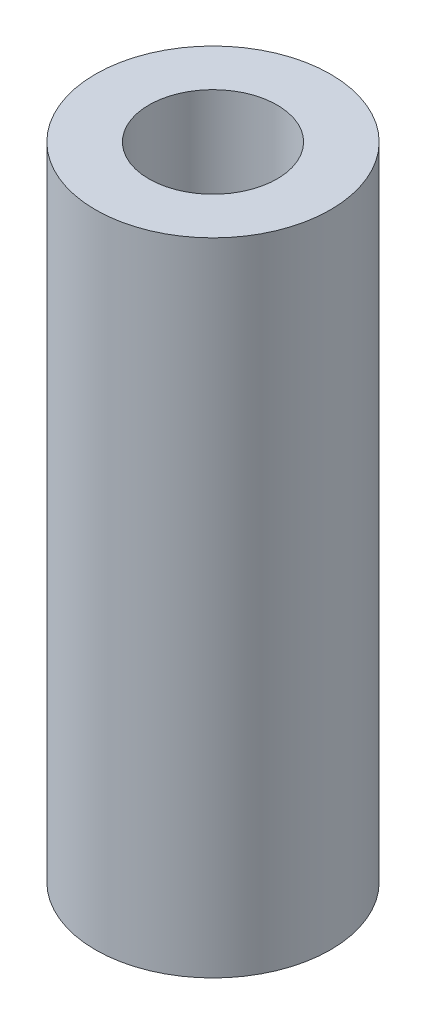
ISO-10303-21;
HEADER;
FILE_DESCRIPTION(('STEP AP214'),'2;1');
FILE_NAME('part.step','',(''),(''),'','','');
FILE_SCHEMA(('AUTOMOTIVE_DESIGN { 1 0 10303 214 1 1 1 1 }'));
ENDSEC;
DATA;
#1=APPLICATION_CONTEXT('core data for automotive mechanical design processes');
#2=APPLICATION_PROTOCOL_DEFINITION('international standard','automotive_design',2000,#1);
#3=PRODUCT_CONTEXT('',#1,'mechanical');
#4=PRODUCT('Part','Part','',(#3));
#5=PRODUCT_RELATED_PRODUCT_CATEGORY('part','',(#4));
#6=PRODUCT_DEFINITION_FORMATION('','',#4);
#7=PRODUCT_DEFINITION_CONTEXT('part definition',#1,'design');
#8=PRODUCT_DEFINITION('design','',#6,#7);
#9=PRODUCT_DEFINITION_SHAPE('','',#8);
#10=(LENGTH_UNIT() NAMED_UNIT(*) SI_UNIT(.MILLI.,.METRE.));
#11=(NAMED_UNIT(*) PLANE_ANGLE_UNIT() SI_UNIT($,.RADIAN.));
#12=(NAMED_UNIT(*) SI_UNIT($,.STERADIAN.) SOLID_ANGLE_UNIT());
#13=UNCERTAINTY_MEASURE_WITH_UNIT(LENGTH_MEASURE(1.E-05),#10,'distance_accuracy_value','');
#14=(GEOMETRIC_REPRESENTATION_CONTEXT(3) GLOBAL_UNCERTAINTY_ASSIGNED_CONTEXT((#13)) GLOBAL_UNIT_ASSIGNED_CONTEXT((#10,
#11,#12)) REPRESENTATION_CONTEXT('',''));
#15=CARTESIAN_POINT('',(0.,0.,0.));
#16=DIRECTION('',(0.,0.,1.));
#17=DIRECTION('',(1.,0.,0.));
#18=AXIS2_PLACEMENT_3D('',#15,#16,#17);
#19=CARTESIAN_POINT('',(0.,18.,0.));
#20=DIRECTION('',(0.,1.,0.));
#21=DIRECTION('',(0.,0.,1.));
#22=AXIS2_PLACEMENT_3D('',#19,#20,#21);
#23=PLANE('',#22);
#24=CARTESIAN_POINT('',(0.,18.,0.));
#25=DIRECTION('',(0.,1.,0.));
#26=DIRECTION('',(0.,0.,1.));
#27=AXIS2_PLACEMENT_3D('',#24,#25,#26);
#28=CIRCLE('',#27,3.3);
#29=CARTESIAN_POINT('',(0.,18.,3.3));
#30=VERTEX_POINT('',#29);
#31=EDGE_CURVE('E10',#30,#30,#28,.T.);
#32=ORIENTED_EDGE('',*,*,#31,.T.);
#33=EDGE_LOOP('',(#32));
#34=FACE_BOUND('',#33,.T.);
#35=CARTESIAN_POINT('',(0.,18.,0.));
#36=DIRECTION('',(0.,1.,0.));
#37=DIRECTION('',(0.,0.,1.));
#38=AXIS2_PLACEMENT_3D('',#35,#36,#37);
#39=CIRCLE('',#38,1.8);
#40=CARTESIAN_POINT('',(0.,18.,1.8));
#41=VERTEX_POINT('',#40);
#42=EDGE_CURVE('E42',#41,#41,#39,.T.);
#43=ORIENTED_EDGE('',*,*,#42,.F.);
#44=EDGE_LOOP('',(#43));
#45=FACE_BOUND('',#44,.T.);
#46=ADVANCED_FACE('F31',(#34,#45),#23,.T.);
#47=CARTESIAN_POINT('',(0.,0.,0.));
#48=DIRECTION('',(0.,1.,0.));
#49=DIRECTION('',(0.,0.,1.));
#50=AXIS2_PLACEMENT_3D('',#47,#48,#49);
#51=PLANE('',#50);
#52=CARTESIAN_POINT('',(0.,0.,0.));
#53=DIRECTION('',(0.,1.,0.));
#54=DIRECTION('',(0.,0.,1.));
#55=AXIS2_PLACEMENT_3D('',#52,#53,#54);
#56=CIRCLE('',#55,3.3);
#57=CARTESIAN_POINT('',(0.,0.,3.3));
#58=VERTEX_POINT('',#57);
#59=EDGE_CURVE('E35',#58,#58,#56,.T.);
#60=ORIENTED_EDGE('',*,*,#59,.F.);
#61=EDGE_LOOP('',(#60));
#62=FACE_BOUND('',#61,.T.);
#63=CARTESIAN_POINT('',(0.,0.,0.));
#64=DIRECTION('',(0.,1.,0.));
#65=DIRECTION('',(0.,0.,1.));
#66=AXIS2_PLACEMENT_3D('',#63,#64,#65);
#67=CIRCLE('',#66,1.8);
#68=CARTESIAN_POINT('',(0.,0.,1.8));
#69=VERTEX_POINT('',#68);
#70=EDGE_CURVE('E44',#69,#69,#67,.T.);
#71=ORIENTED_EDGE('',*,*,#70,.T.);
#72=EDGE_LOOP('',(#71));
#73=FACE_BOUND('',#72,.T.);
#74=ADVANCED_FACE('F54',(#62,#73),#51,.F.);
#75=CARTESIAN_POINT('',(0.,18.,0.));
#76=DIRECTION('',(0.,-1.,0.));
#77=DIRECTION('',(0.,0.,-1.));
#78=AXIS2_PLACEMENT_3D('',#75,#76,#77);
#79=CYLINDRICAL_SURFACE('',#78,3.3);
#80=ORIENTED_EDGE('',*,*,#31,.F.);
#81=EDGE_LOOP('',(#80));
#82=FACE_BOUND('',#81,.T.);
#83=ORIENTED_EDGE('',*,*,#59,.T.);
#84=EDGE_LOOP('',(#83));
#85=FACE_BOUND('',#84,.T.);
#86=ADVANCED_FACE('F33',(#82,#85),#79,.T.);
#87=CARTESIAN_POINT('',(0.,18.,0.));
#88=DIRECTION('',(0.,-1.,0.));
#89=DIRECTION('',(0.,0.,-1.));
#90=AXIS2_PLACEMENT_3D('',#87,#88,#89);
#91=CYLINDRICAL_SURFACE('',#90,1.8);
#92=ORIENTED_EDGE('',*,*,#42,.T.);
#93=EDGE_LOOP('',(#92));
#94=FACE_BOUND('',#93,.T.);
#95=ORIENTED_EDGE('',*,*,#70,.F.);
#96=EDGE_LOOP('',(#95));
#97=FACE_BOUND('',#96,.T.);
#98=ADVANCED_FACE('F50',(#94,#97),#91,.F.);
#99=CLOSED_SHELL('',(#46,#74,#86,#98));
#100=MANIFOLD_SOLID_BREP('B2',#99);
#101=ADVANCED_BREP_SHAPE_REPRESENTATION('',(#18,#100),#14);
#102=SHAPE_DEFINITION_REPRESENTATION(#9,#101);
ENDSEC;
END-ISO-10303-21;
